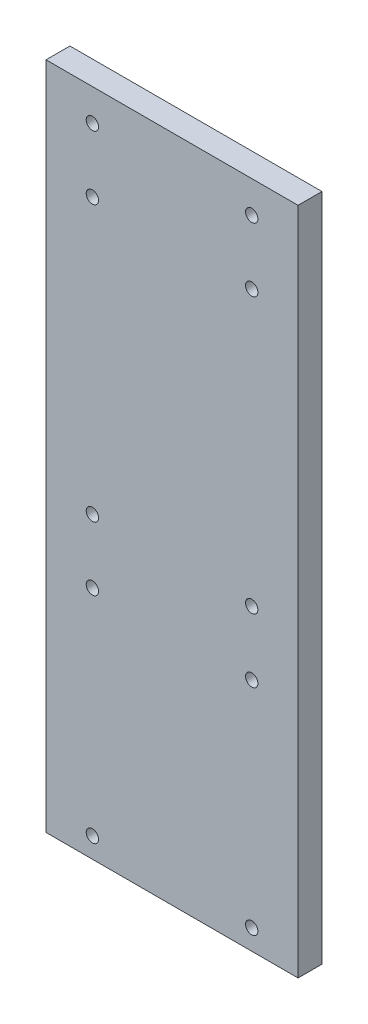
ISO-10303-21;
HEADER;
FILE_DESCRIPTION(('STEP AP214'),'2;1');
FILE_NAME('part.step','',(''),(''),'','','');
FILE_SCHEMA(('AUTOMOTIVE_DESIGN { 1 0 10303 214 1 1 1 1 }'));
ENDSEC;
DATA;
#1=APPLICATION_CONTEXT('core data for automotive mechanical design processes');
#2=APPLICATION_PROTOCOL_DEFINITION('international standard','automotive_design',2000,#1);
#3=PRODUCT_CONTEXT('',#1,'mechanical');
#4=PRODUCT('Part','Part','',(#3));
#5=PRODUCT_RELATED_PRODUCT_CATEGORY('part','',(#4));
#6=PRODUCT_DEFINITION_FORMATION('','',#4);
#7=PRODUCT_DEFINITION_CONTEXT('part definition',#1,'design');
#8=PRODUCT_DEFINITION('design','',#6,#7);
#9=PRODUCT_DEFINITION_SHAPE('','',#8);
#10=(LENGTH_UNIT() NAMED_UNIT(*) SI_UNIT(.MILLI.,.METRE.));
#11=(NAMED_UNIT(*) PLANE_ANGLE_UNIT() SI_UNIT($,.RADIAN.));
#12=(NAMED_UNIT(*) SI_UNIT($,.STERADIAN.) SOLID_ANGLE_UNIT());
#13=UNCERTAINTY_MEASURE_WITH_UNIT(LENGTH_MEASURE(1.E-05),#10,'distance_accuracy_value','');
#14=(GEOMETRIC_REPRESENTATION_CONTEXT(3) GLOBAL_UNCERTAINTY_ASSIGNED_CONTEXT((#13)) GLOBAL_UNIT_ASSIGNED_CONTEXT((#10,
#11,#12)) REPRESENTATION_CONTEXT('',''));
#15=CARTESIAN_POINT('',(0.,0.,0.));
#16=DIRECTION('',(0.,0.,1.));
#17=DIRECTION('',(1.,0.,0.));
#18=AXIS2_PLACEMENT_3D('',#15,#16,#17);
#19=CARTESIAN_POINT('',(1151.49803930094,-961.922207313734,6.));
#20=DIRECTION('',(0.,1.,0.));
#21=DIRECTION('',(0.,0.,1.));
#22=AXIS2_PLACEMENT_3D('',#19,#20,#21);
#23=PLANE('',#22);
#24=DIRECTION('',(1.,0.,0.));
#25=VECTOR('',#24,1.);
#26=CARTESIAN_POINT('',(1151.49803930094,-961.922207313734,0.));
#27=LINE('',#26,#25);
#28=CARTESIAN_POINT('',(1151.49803930094,-961.922207313734,0.));
#29=VERTEX_POINT('',#28);
#30=CARTESIAN_POINT('',(1214.76803930094,-961.922207313734,0.));
#31=VERTEX_POINT('',#30);
#32=EDGE_CURVE('E97',#29,#31,#27,.T.);
#33=ORIENTED_EDGE('',*,*,#32,.T.);
#34=DIRECTION('',(0.,0.,-1.));
#35=VECTOR('',#34,1.);
#36=CARTESIAN_POINT('',(1214.76803930094,-961.922207313734,6.));
#37=LINE('',#36,#35);
#38=CARTESIAN_POINT('',(1214.76803930094,-961.922207313734,6.));
#39=VERTEX_POINT('',#38);
#40=EDGE_CURVE('E11',#39,#31,#37,.T.);
#41=ORIENTED_EDGE('',*,*,#40,.F.);
#42=DIRECTION('',(1.,0.,0.));
#43=VECTOR('',#42,1.);
#44=CARTESIAN_POINT('',(1151.49803930094,-961.922207313734,6.));
#45=LINE('',#44,#43);
#46=CARTESIAN_POINT('',(1151.49803930094,-961.922207313734,6.));
#47=VERTEX_POINT('',#46);
#48=EDGE_CURVE('E85',#47,#39,#45,.T.);
#49=ORIENTED_EDGE('',*,*,#48,.F.);
#50=DIRECTION('',(0.,0.,-1.));
#51=VECTOR('',#50,1.);
#52=CARTESIAN_POINT('',(1151.49803930094,-961.922207313734,6.));
#53=LINE('',#52,#51);
#54=EDGE_CURVE('E93',#47,#29,#53,.T.);
#55=ORIENTED_EDGE('',*,*,#54,.T.);
#56=EDGE_LOOP('',(#33,#41,#49,#55));
#57=FACE_BOUND('',#56,.T.);
#58=ADVANCED_FACE('F34',(#57),#23,.F.);
#59=CARTESIAN_POINT('',(1214.76803930094,-961.922207313734,6.));
#60=DIRECTION('',(-1.,0.,0.));
#61=DIRECTION('',(0.,0.,1.));
#62=AXIS2_PLACEMENT_3D('',#59,#60,#61);
#63=PLANE('',#62);
#64=DIRECTION('',(0.,1.,0.));
#65=VECTOR('',#64,1.);
#66=CARTESIAN_POINT('',(1214.76803930094,-961.922207313734,0.));
#67=LINE('',#66,#65);
#68=CARTESIAN_POINT('',(1214.76803930094,-793.922207313734,0.));
#69=VERTEX_POINT('',#68);
#70=EDGE_CURVE('E89',#31,#69,#67,.T.);
#71=ORIENTED_EDGE('',*,*,#70,.T.);
#72=DIRECTION('',(0.,0.,-1.));
#73=VECTOR('',#72,1.);
#74=CARTESIAN_POINT('',(1214.76803930094,-793.922207313734,6.));
#75=LINE('',#74,#73);
#76=CARTESIAN_POINT('',(1214.76803930094,-793.922207313734,6.));
#77=VERTEX_POINT('',#76);
#78=EDGE_CURVE('E42',#77,#69,#75,.T.);
#79=ORIENTED_EDGE('',*,*,#78,.F.);
#80=DIRECTION('',(0.,1.,0.));
#81=VECTOR('',#80,1.);
#82=CARTESIAN_POINT('',(1214.76803930094,-961.922207313734,6.));
#83=LINE('',#82,#81);
#84=EDGE_CURVE('E80',#39,#77,#83,.T.);
#85=ORIENTED_EDGE('',*,*,#84,.F.);
#86=ORIENTED_EDGE('',*,*,#40,.T.);
#87=EDGE_LOOP('',(#71,#79,#85,#86));
#88=FACE_BOUND('',#87,.T.);
#89=ADVANCED_FACE('F88',(#88),#63,.F.);
#90=CARTESIAN_POINT('',(1151.49803930094,-793.922207313734,6.));
#91=DIRECTION('',(0.,-1.,0.));
#92=DIRECTION('',(0.,0.,-1.));
#93=AXIS2_PLACEMENT_3D('',#90,#91,#92);
#94=PLANE('',#93);
#95=DIRECTION('',(-1.,0.,0.));
#96=VECTOR('',#95,1.);
#97=CARTESIAN_POINT('',(1151.49803930094,-793.922207313734,0.));
#98=LINE('',#97,#96);
#99=CARTESIAN_POINT('',(1151.49803930094,-793.922207313734,0.));
#100=VERTEX_POINT('',#99);
#101=EDGE_CURVE('E67',#69,#100,#98,.T.);
#102=ORIENTED_EDGE('',*,*,#101,.T.);
#103=DIRECTION('',(0.,0.,-1.));
#104=VECTOR('',#103,1.);
#105=CARTESIAN_POINT('',(1151.49803930094,-793.922207313734,6.));
#106=LINE('',#105,#104);
#107=CARTESIAN_POINT('',(1151.49803930094,-793.922207313734,6.));
#108=VERTEX_POINT('',#107);
#109=EDGE_CURVE('E90',#108,#100,#106,.T.);
#110=ORIENTED_EDGE('',*,*,#109,.F.);
#111=DIRECTION('',(-1.,0.,0.));
#112=VECTOR('',#111,1.);
#113=CARTESIAN_POINT('',(1151.49803930094,-793.922207313734,6.));
#114=LINE('',#113,#112);
#115=EDGE_CURVE('E83',#77,#108,#114,.T.);
#116=ORIENTED_EDGE('',*,*,#115,.F.);
#117=ORIENTED_EDGE('',*,*,#78,.T.);
#118=EDGE_LOOP('',(#102,#110,#116,#117));
#119=FACE_BOUND('',#118,.T.);
#120=ADVANCED_FACE('F91',(#119),#94,.F.);
#121=CARTESIAN_POINT('',(1151.49803930094,-961.922207313734,6.));
#122=DIRECTION('',(1.,0.,0.));
#123=DIRECTION('',(0.,0.,-1.));
#124=AXIS2_PLACEMENT_3D('',#121,#122,#123);
#125=PLANE('',#124);
#126=DIRECTION('',(0.,-1.,0.));
#127=VECTOR('',#126,1.);
#128=CARTESIAN_POINT('',(1151.49803930094,-961.922207313734,0.));
#129=LINE('',#128,#127);
#130=EDGE_CURVE('E73',#100,#29,#129,.T.);
#131=ORIENTED_EDGE('',*,*,#130,.T.);
#132=ORIENTED_EDGE('',*,*,#54,.F.);
#133=DIRECTION('',(0.,-1.,0.));
#134=VECTOR('',#133,1.);
#135=CARTESIAN_POINT('',(1151.49803930094,-961.922207313734,6.));
#136=LINE('',#135,#134);
#137=EDGE_CURVE('E50',#108,#47,#136,.T.);
#138=ORIENTED_EDGE('',*,*,#137,.F.);
#139=ORIENTED_EDGE('',*,*,#109,.T.);
#140=EDGE_LOOP('',(#131,#132,#138,#139));
#141=FACE_BOUND('',#140,.T.);
#142=ADVANCED_FACE('F105',(#141),#125,.F.);
#143=CARTESIAN_POINT('',(0.,0.,6.));
#144=DIRECTION('',(0.,0.,1.));
#145=DIRECTION('',(1.,0.,0.));
#146=AXIS2_PLACEMENT_3D('',#143,#144,#145);
#147=PLANE('',#146);
#148=CARTESIAN_POINT('',(1163.13303930096,-817.922207313734,6.));
#149=DIRECTION('',(0.,0.,1.));
#150=DIRECTION('',(1.,0.,0.));
#151=AXIS2_PLACEMENT_3D('',#148,#149,#150);
#152=CIRCLE('',#151,1.54999999999998);
#153=CARTESIAN_POINT('',(1164.68303930096,-817.922207313734,6.));
#154=VERTEX_POINT('',#153);
#155=EDGE_CURVE('E165',#154,#154,#152,.T.);
#156=ORIENTED_EDGE('',*,*,#155,.F.);
#157=EDGE_LOOP('',(#156));
#158=FACE_BOUND('',#157,.T.);
#159=CARTESIAN_POINT('',(1203.13303930096,-817.922207313734,6.));
#160=DIRECTION('',(0.,0.,1.));
#161=DIRECTION('',(1.,0.,0.));
#162=AXIS2_PLACEMENT_3D('',#159,#160,#161);
#163=CIRCLE('',#162,1.54999999999998);
#164=CARTESIAN_POINT('',(1204.68303930096,-817.922207313734,6.));
#165=VERTEX_POINT('',#164);
#166=EDGE_CURVE('E159',#165,#165,#163,.T.);
#167=ORIENTED_EDGE('',*,*,#166,.F.);
#168=EDGE_LOOP('',(#167));
#169=FACE_BOUND('',#168,.T.);
#170=CARTESIAN_POINT('',(1203.13303930096,-902.922207313734,6.));
#171=DIRECTION('',(0.,0.,1.));
#172=DIRECTION('',(1.,0.,0.));
#173=AXIS2_PLACEMENT_3D('',#170,#171,#172);
#174=CIRCLE('',#173,1.54999999999998);
#175=CARTESIAN_POINT('',(1204.68303930096,-902.922207313734,6.));
#176=VERTEX_POINT('',#175);
#177=EDGE_CURVE('E153',#176,#176,#174,.T.);
#178=ORIENTED_EDGE('',*,*,#177,.F.);
#179=EDGE_LOOP('',(#178));
#180=FACE_BOUND('',#179,.T.);
#181=CARTESIAN_POINT('',(1163.13303930096,-902.922207313734,6.));
#182=DIRECTION('',(0.,0.,1.));
#183=DIRECTION('',(1.,0.,0.));
#184=AXIS2_PLACEMENT_3D('',#181,#182,#183);
#185=CIRCLE('',#184,1.54999999999998);
#186=CARTESIAN_POINT('',(1164.68303930096,-902.922207313734,6.));
#187=VERTEX_POINT('',#186);
#188=EDGE_CURVE('E147',#187,#187,#185,.T.);
#189=ORIENTED_EDGE('',*,*,#188,.F.);
#190=EDGE_LOOP('',(#189));
#191=FACE_BOUND('',#190,.T.);
#192=CARTESIAN_POINT('',(1163.13303930096,-801.922207313734,6.));
#193=DIRECTION('',(0.,0.,1.));
#194=DIRECTION('',(1.,0.,0.));
#195=AXIS2_PLACEMENT_3D('',#192,#193,#194);
#196=CIRCLE('',#195,1.54999999999998);
#197=CARTESIAN_POINT('',(1164.68303930096,-801.922207313734,6.));
#198=VERTEX_POINT('',#197);
#199=EDGE_CURVE('E141',#198,#198,#196,.T.);
#200=ORIENTED_EDGE('',*,*,#199,.F.);
#201=EDGE_LOOP('',(#200));
#202=FACE_BOUND('',#201,.T.);
#203=CARTESIAN_POINT('',(1203.13303930096,-801.922207313734,6.));
#204=DIRECTION('',(0.,0.,1.));
#205=DIRECTION('',(1.,0.,0.));
#206=AXIS2_PLACEMENT_3D('',#203,#204,#205);
#207=CIRCLE('',#206,1.54999999999998);
#208=CARTESIAN_POINT('',(1204.68303930096,-801.922207313734,6.));
#209=VERTEX_POINT('',#208);
#210=EDGE_CURVE('E135',#209,#209,#207,.T.);
#211=ORIENTED_EDGE('',*,*,#210,.F.);
#212=EDGE_LOOP('',(#211));
#213=FACE_BOUND('',#212,.T.);
#214=CARTESIAN_POINT('',(1203.13303930096,-886.922207313733,6.));
#215=DIRECTION('',(0.,0.,1.));
#216=DIRECTION('',(1.,0.,0.));
#217=AXIS2_PLACEMENT_3D('',#214,#215,#216);
#218=CIRCLE('',#217,1.54999999999998);
#219=CARTESIAN_POINT('',(1204.68303930096,-886.922207313733,6.));
#220=VERTEX_POINT('',#219);
#221=EDGE_CURVE('E129',#220,#220,#218,.T.);
#222=ORIENTED_EDGE('',*,*,#221,.F.);
#223=EDGE_LOOP('',(#222));
#224=FACE_BOUND('',#223,.T.);
#225=CARTESIAN_POINT('',(1163.13303930096,-886.922207313734,6.));
#226=DIRECTION('',(0.,0.,1.));
#227=DIRECTION('',(1.,0.,0.));
#228=AXIS2_PLACEMENT_3D('',#225,#226,#227);
#229=CIRCLE('',#228,1.54999999999998);
#230=CARTESIAN_POINT('',(1164.68303930096,-886.922207313734,6.));
#231=VERTEX_POINT('',#230);
#232=EDGE_CURVE('E123',#231,#231,#229,.T.);
#233=ORIENTED_EDGE('',*,*,#232,.F.);
#234=EDGE_LOOP('',(#233));
#235=FACE_BOUND('',#234,.T.);
#236=CARTESIAN_POINT('',(1163.13303930095,-956.82220731373,6.));
#237=DIRECTION('',(0.,0.,1.));
#238=DIRECTION('',(1.,0.,0.));
#239=AXIS2_PLACEMENT_3D('',#236,#237,#238);
#240=CIRCLE('',#239,1.54999999999998);
#241=CARTESIAN_POINT('',(1164.68303930095,-956.82220731373,6.));
#242=VERTEX_POINT('',#241);
#243=EDGE_CURVE('E117',#242,#242,#240,.T.);
#244=ORIENTED_EDGE('',*,*,#243,.F.);
#245=EDGE_LOOP('',(#244));
#246=FACE_BOUND('',#245,.T.);
#247=CARTESIAN_POINT('',(1203.13303930095,-956.82220731373,6.));
#248=DIRECTION('',(0.,0.,1.));
#249=DIRECTION('',(1.,0.,0.));
#250=AXIS2_PLACEMENT_3D('',#247,#248,#249);
#251=CIRCLE('',#250,1.54999999999998);
#252=CARTESIAN_POINT('',(1204.68303930095,-956.82220731373,6.));
#253=VERTEX_POINT('',#252);
#254=EDGE_CURVE('E111',#253,#253,#251,.T.);
#255=ORIENTED_EDGE('',*,*,#254,.F.);
#256=EDGE_LOOP('',(#255));
#257=FACE_BOUND('',#256,.T.);
#258=ORIENTED_EDGE('',*,*,#48,.T.);
#259=ORIENTED_EDGE('',*,*,#84,.T.);
#260=ORIENTED_EDGE('',*,*,#115,.T.);
#261=ORIENTED_EDGE('',*,*,#137,.T.);
#262=EDGE_LOOP('',(#258,#259,#260,#261));
#263=FACE_BOUND('',#262,.T.);
#264=ADVANCED_FACE('F81',(#158,#169,#180,#191,#202,#213,#224,#235,#246,#257,#263),#147,.T.);
#265=CARTESIAN_POINT('',(0.,0.,0.));
#266=DIRECTION('',(0.,0.,1.));
#267=DIRECTION('',(1.,0.,0.));
#268=AXIS2_PLACEMENT_3D('',#265,#266,#267);
#269=PLANE('',#268);
#270=CARTESIAN_POINT('',(1163.13303930096,-817.922207313734,0.));
#271=DIRECTION('',(0.,0.,1.));
#272=DIRECTION('',(1.,0.,0.));
#273=AXIS2_PLACEMENT_3D('',#270,#271,#272);
#274=CIRCLE('',#273,1.54999999999998);
#275=CARTESIAN_POINT('',(1164.68303930096,-817.922207313734,0.));
#276=VERTEX_POINT('',#275);
#277=EDGE_CURVE('E162',#276,#276,#274,.T.);
#278=ORIENTED_EDGE('',*,*,#277,.T.);
#279=EDGE_LOOP('',(#278));
#280=FACE_BOUND('',#279,.T.);
#281=CARTESIAN_POINT('',(1203.13303930096,-817.922207313734,0.));
#282=DIRECTION('',(0.,0.,1.));
#283=DIRECTION('',(1.,0.,0.));
#284=AXIS2_PLACEMENT_3D('',#281,#282,#283);
#285=CIRCLE('',#284,1.54999999999998);
#286=CARTESIAN_POINT('',(1204.68303930096,-817.922207313734,0.));
#287=VERTEX_POINT('',#286);
#288=EDGE_CURVE('E156',#287,#287,#285,.T.);
#289=ORIENTED_EDGE('',*,*,#288,.T.);
#290=EDGE_LOOP('',(#289));
#291=FACE_BOUND('',#290,.T.);
#292=CARTESIAN_POINT('',(1203.13303930096,-902.922207313734,0.));
#293=DIRECTION('',(0.,0.,1.));
#294=DIRECTION('',(1.,0.,0.));
#295=AXIS2_PLACEMENT_3D('',#292,#293,#294);
#296=CIRCLE('',#295,1.54999999999998);
#297=CARTESIAN_POINT('',(1204.68303930096,-902.922207313734,0.));
#298=VERTEX_POINT('',#297);
#299=EDGE_CURVE('E150',#298,#298,#296,.T.);
#300=ORIENTED_EDGE('',*,*,#299,.T.);
#301=EDGE_LOOP('',(#300));
#302=FACE_BOUND('',#301,.T.);
#303=CARTESIAN_POINT('',(1163.13303930096,-902.922207313734,0.));
#304=DIRECTION('',(0.,0.,1.));
#305=DIRECTION('',(1.,0.,0.));
#306=AXIS2_PLACEMENT_3D('',#303,#304,#305);
#307=CIRCLE('',#306,1.54999999999998);
#308=CARTESIAN_POINT('',(1164.68303930096,-902.922207313734,0.));
#309=VERTEX_POINT('',#308);
#310=EDGE_CURVE('E144',#309,#309,#307,.T.);
#311=ORIENTED_EDGE('',*,*,#310,.T.);
#312=EDGE_LOOP('',(#311));
#313=FACE_BOUND('',#312,.T.);
#314=CARTESIAN_POINT('',(1163.13303930096,-801.922207313734,0.));
#315=DIRECTION('',(0.,0.,1.));
#316=DIRECTION('',(1.,0.,0.));
#317=AXIS2_PLACEMENT_3D('',#314,#315,#316);
#318=CIRCLE('',#317,1.54999999999998);
#319=CARTESIAN_POINT('',(1164.68303930096,-801.922207313734,0.));
#320=VERTEX_POINT('',#319);
#321=EDGE_CURVE('E138',#320,#320,#318,.T.);
#322=ORIENTED_EDGE('',*,*,#321,.T.);
#323=EDGE_LOOP('',(#322));
#324=FACE_BOUND('',#323,.T.);
#325=CARTESIAN_POINT('',(1203.13303930096,-801.922207313734,0.));
#326=DIRECTION('',(0.,0.,1.));
#327=DIRECTION('',(1.,0.,0.));
#328=AXIS2_PLACEMENT_3D('',#325,#326,#327);
#329=CIRCLE('',#328,1.54999999999998);
#330=CARTESIAN_POINT('',(1204.68303930096,-801.922207313734,0.));
#331=VERTEX_POINT('',#330);
#332=EDGE_CURVE('E132',#331,#331,#329,.T.);
#333=ORIENTED_EDGE('',*,*,#332,.T.);
#334=EDGE_LOOP('',(#333));
#335=FACE_BOUND('',#334,.T.);
#336=CARTESIAN_POINT('',(1203.13303930096,-886.922207313733,0.));
#337=DIRECTION('',(0.,0.,1.));
#338=DIRECTION('',(1.,0.,0.));
#339=AXIS2_PLACEMENT_3D('',#336,#337,#338);
#340=CIRCLE('',#339,1.54999999999998);
#341=CARTESIAN_POINT('',(1204.68303930096,-886.922207313733,0.));
#342=VERTEX_POINT('',#341);
#343=EDGE_CURVE('E126',#342,#342,#340,.T.);
#344=ORIENTED_EDGE('',*,*,#343,.T.);
#345=EDGE_LOOP('',(#344));
#346=FACE_BOUND('',#345,.T.);
#347=CARTESIAN_POINT('',(1163.13303930096,-886.922207313734,0.));
#348=DIRECTION('',(0.,0.,1.));
#349=DIRECTION('',(1.,0.,0.));
#350=AXIS2_PLACEMENT_3D('',#347,#348,#349);
#351=CIRCLE('',#350,1.54999999999998);
#352=CARTESIAN_POINT('',(1164.68303930096,-886.922207313734,0.));
#353=VERTEX_POINT('',#352);
#354=EDGE_CURVE('E120',#353,#353,#351,.T.);
#355=ORIENTED_EDGE('',*,*,#354,.T.);
#356=EDGE_LOOP('',(#355));
#357=FACE_BOUND('',#356,.T.);
#358=CARTESIAN_POINT('',(1163.13303930095,-956.82220731373,0.));
#359=DIRECTION('',(0.,0.,1.));
#360=DIRECTION('',(1.,0.,0.));
#361=AXIS2_PLACEMENT_3D('',#358,#359,#360);
#362=CIRCLE('',#361,1.54999999999998);
#363=CARTESIAN_POINT('',(1164.68303930095,-956.82220731373,0.));
#364=VERTEX_POINT('',#363);
#365=EDGE_CURVE('E114',#364,#364,#362,.T.);
#366=ORIENTED_EDGE('',*,*,#365,.T.);
#367=EDGE_LOOP('',(#366));
#368=FACE_BOUND('',#367,.T.);
#369=CARTESIAN_POINT('',(1203.13303930095,-956.82220731373,0.));
#370=DIRECTION('',(0.,0.,1.));
#371=DIRECTION('',(1.,0.,0.));
#372=AXIS2_PLACEMENT_3D('',#369,#370,#371);
#373=CIRCLE('',#372,1.54999999999998);
#374=CARTESIAN_POINT('',(1204.68303930095,-956.82220731373,0.));
#375=VERTEX_POINT('',#374);
#376=EDGE_CURVE('E100',#375,#375,#373,.T.);
#377=ORIENTED_EDGE('',*,*,#376,.T.);
#378=EDGE_LOOP('',(#377));
#379=FACE_BOUND('',#378,.T.);
#380=ORIENTED_EDGE('',*,*,#32,.F.);
#381=ORIENTED_EDGE('',*,*,#130,.F.);
#382=ORIENTED_EDGE('',*,*,#101,.F.);
#383=ORIENTED_EDGE('',*,*,#70,.F.);
#384=EDGE_LOOP('',(#380,#381,#382,#383));
#385=FACE_BOUND('',#384,.T.);
#386=ADVANCED_FACE('F108',(#280,#291,#302,#313,#324,#335,#346,#357,#368,#379,#385),#269,.F.);
#387=CARTESIAN_POINT('',(1203.13303930095,-956.82220731373,0.));
#388=DIRECTION('',(0.,0.,1.));
#389=DIRECTION('',(1.,0.,0.));
#390=AXIS2_PLACEMENT_3D('',#387,#388,#389);
#391=CYLINDRICAL_SURFACE('',#390,1.54999999999998);
#392=ORIENTED_EDGE('',*,*,#376,.F.);
#393=EDGE_LOOP('',(#392));
#394=FACE_BOUND('',#393,.T.);
#395=ORIENTED_EDGE('',*,*,#254,.T.);
#396=EDGE_LOOP('',(#395));
#397=FACE_BOUND('',#396,.T.);
#398=ADVANCED_FACE('F201',(#394,#397),#391,.F.);
#399=CARTESIAN_POINT('',(1163.13303930095,-956.82220731373,0.));
#400=DIRECTION('',(0.,0.,1.));
#401=DIRECTION('',(1.,0.,0.));
#402=AXIS2_PLACEMENT_3D('',#399,#400,#401);
#403=CYLINDRICAL_SURFACE('',#402,1.54999999999998);
#404=ORIENTED_EDGE('',*,*,#365,.F.);
#405=EDGE_LOOP('',(#404));
#406=FACE_BOUND('',#405,.T.);
#407=ORIENTED_EDGE('',*,*,#243,.T.);
#408=EDGE_LOOP('',(#407));
#409=FACE_BOUND('',#408,.T.);
#410=ADVANCED_FACE('F203',(#406,#409),#403,.F.);
#411=CARTESIAN_POINT('',(1163.13303930096,-886.922207313734,0.));
#412=DIRECTION('',(0.,0.,1.));
#413=DIRECTION('',(1.,0.,0.));
#414=AXIS2_PLACEMENT_3D('',#411,#412,#413);
#415=CYLINDRICAL_SURFACE('',#414,1.54999999999998);
#416=ORIENTED_EDGE('',*,*,#354,.F.);
#417=EDGE_LOOP('',(#416));
#418=FACE_BOUND('',#417,.T.);
#419=ORIENTED_EDGE('',*,*,#232,.T.);
#420=EDGE_LOOP('',(#419));
#421=FACE_BOUND('',#420,.T.);
#422=ADVANCED_FACE('F210',(#418,#421),#415,.F.);
#423=CARTESIAN_POINT('',(1203.13303930096,-886.922207313733,0.));
#424=DIRECTION('',(0.,0.,1.));
#425=DIRECTION('',(1.,0.,0.));
#426=AXIS2_PLACEMENT_3D('',#423,#424,#425);
#427=CYLINDRICAL_SURFACE('',#426,1.54999999999998);
#428=ORIENTED_EDGE('',*,*,#343,.F.);
#429=EDGE_LOOP('',(#428));
#430=FACE_BOUND('',#429,.T.);
#431=ORIENTED_EDGE('',*,*,#221,.T.);
#432=EDGE_LOOP('',(#431));
#433=FACE_BOUND('',#432,.T.);
#434=ADVANCED_FACE('F289',(#430,#433),#427,.F.);
#435=CARTESIAN_POINT('',(1203.13303930096,-801.922207313734,0.));
#436=DIRECTION('',(0.,0.,1.));
#437=DIRECTION('',(1.,0.,0.));
#438=AXIS2_PLACEMENT_3D('',#435,#436,#437);
#439=CYLINDRICAL_SURFACE('',#438,1.54999999999998);
#440=ORIENTED_EDGE('',*,*,#332,.F.);
#441=EDGE_LOOP('',(#440));
#442=FACE_BOUND('',#441,.T.);
#443=ORIENTED_EDGE('',*,*,#210,.T.);
#444=EDGE_LOOP('',(#443));
#445=FACE_BOUND('',#444,.T.);
#446=ADVANCED_FACE('F285',(#442,#445),#439,.F.);
#447=CARTESIAN_POINT('',(1163.13303930096,-801.922207313734,0.));
#448=DIRECTION('',(0.,0.,1.));
#449=DIRECTION('',(1.,0.,0.));
#450=AXIS2_PLACEMENT_3D('',#447,#448,#449);
#451=CYLINDRICAL_SURFACE('',#450,1.54999999999998);
#452=ORIENTED_EDGE('',*,*,#321,.F.);
#453=EDGE_LOOP('',(#452));
#454=FACE_BOUND('',#453,.T.);
#455=ORIENTED_EDGE('',*,*,#199,.T.);
#456=EDGE_LOOP('',(#455));
#457=FACE_BOUND('',#456,.T.);
#458=ADVANCED_FACE('F250',(#454,#457),#451,.F.);
#459=CARTESIAN_POINT('',(1163.13303930096,-902.922207313734,0.));
#460=DIRECTION('',(0.,0.,1.));
#461=DIRECTION('',(1.,0.,0.));
#462=AXIS2_PLACEMENT_3D('',#459,#460,#461);
#463=CYLINDRICAL_SURFACE('',#462,1.54999999999998);
#464=ORIENTED_EDGE('',*,*,#310,.F.);
#465=EDGE_LOOP('',(#464));
#466=FACE_BOUND('',#465,.T.);
#467=ORIENTED_EDGE('',*,*,#188,.T.);
#468=EDGE_LOOP('',(#467));
#469=FACE_BOUND('',#468,.T.);
#470=ADVANCED_FACE('F244',(#466,#469),#463,.F.);
#471=CARTESIAN_POINT('',(1203.13303930096,-902.922207313734,0.));
#472=DIRECTION('',(0.,0.,1.));
#473=DIRECTION('',(1.,0.,0.));
#474=AXIS2_PLACEMENT_3D('',#471,#472,#473);
#475=CYLINDRICAL_SURFACE('',#474,1.54999999999998);
#476=ORIENTED_EDGE('',*,*,#299,.F.);
#477=EDGE_LOOP('',(#476));
#478=FACE_BOUND('',#477,.T.);
#479=ORIENTED_EDGE('',*,*,#177,.T.);
#480=EDGE_LOOP('',(#479));
#481=FACE_BOUND('',#480,.T.);
#482=ADVANCED_FACE('F249',(#478,#481),#475,.F.);
#483=CARTESIAN_POINT('',(1203.13303930096,-817.922207313734,0.));
#484=DIRECTION('',(0.,0.,1.));
#485=DIRECTION('',(1.,0.,0.));
#486=AXIS2_PLACEMENT_3D('',#483,#484,#485);
#487=CYLINDRICAL_SURFACE('',#486,1.54999999999998);
#488=ORIENTED_EDGE('',*,*,#288,.F.);
#489=EDGE_LOOP('',(#488));
#490=FACE_BOUND('',#489,.T.);
#491=ORIENTED_EDGE('',*,*,#166,.T.);
#492=EDGE_LOOP('',(#491));
#493=FACE_BOUND('',#492,.T.);
#494=ADVANCED_FACE('F176',(#490,#493),#487,.F.);
#495=CARTESIAN_POINT('',(1163.13303930096,-817.922207313734,0.));
#496=DIRECTION('',(0.,0.,1.));
#497=DIRECTION('',(1.,0.,0.));
#498=AXIS2_PLACEMENT_3D('',#495,#496,#497);
#499=CYLINDRICAL_SURFACE('',#498,1.54999999999998);
#500=ORIENTED_EDGE('',*,*,#277,.F.);
#501=EDGE_LOOP('',(#500));
#502=FACE_BOUND('',#501,.T.);
#503=ORIENTED_EDGE('',*,*,#155,.T.);
#504=EDGE_LOOP('',(#503));
#505=FACE_BOUND('',#504,.T.);
#506=ADVANCED_FACE('F173',(#502,#505),#499,.F.);
#507=CLOSED_SHELL('',(#58,#89,#120,#142,#264,#386,#398,#410,#422,#434,#446,#458,#470,#482,#494,#506));
#508=MANIFOLD_SOLID_BREP('B2',#507);
#509=ADVANCED_BREP_SHAPE_REPRESENTATION('',(#18,#508),#14);
#510=SHAPE_DEFINITION_REPRESENTATION(#9,#509);
ENDSEC;
END-ISO-10303-21;
